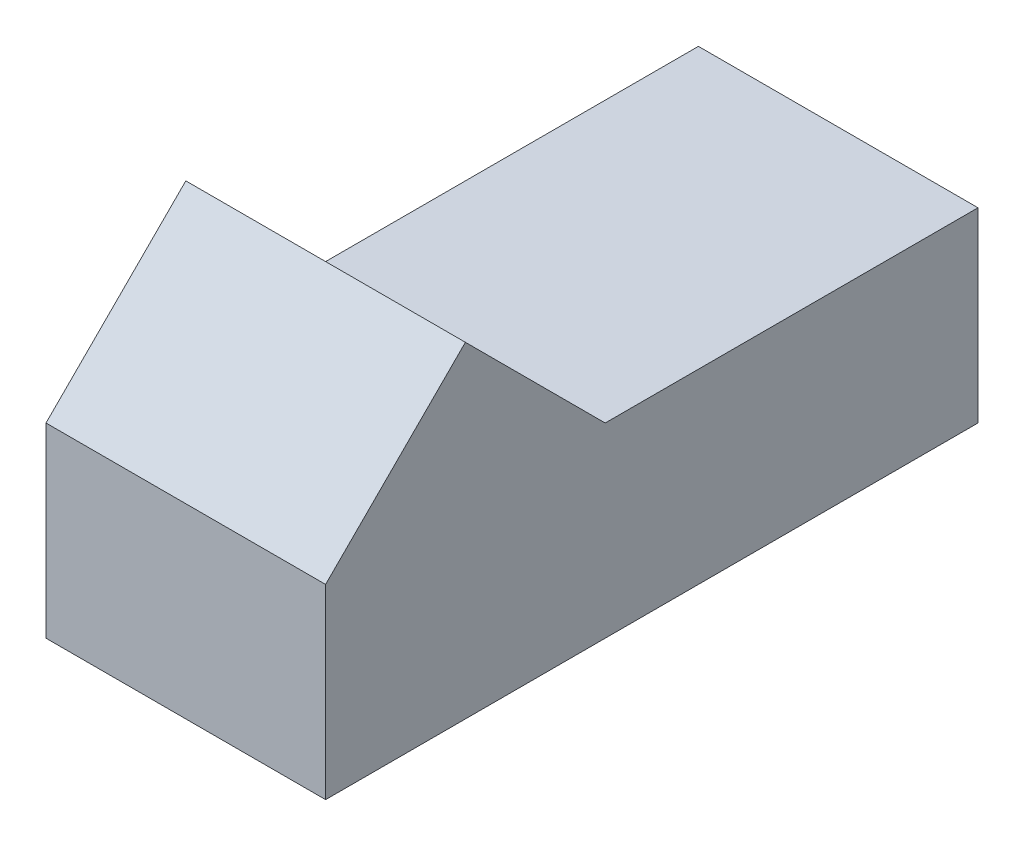
ISO-10303-21;
HEADER;
FILE_DESCRIPTION(('STEP AP214'),'2;1');
FILE_NAME('part.step','',(''),(''),'','','');
FILE_SCHEMA(('AUTOMOTIVE_DESIGN { 1 0 10303 214 1 1 1 1 }'));
ENDSEC;
DATA;
#1=APPLICATION_CONTEXT('core data for automotive mechanical design processes');
#2=APPLICATION_PROTOCOL_DEFINITION('international standard','automotive_design',2000,#1);
#3=PRODUCT_CONTEXT('',#1,'mechanical');
#4=PRODUCT('Part','Part','',(#3));
#5=PRODUCT_RELATED_PRODUCT_CATEGORY('part','',(#4));
#6=PRODUCT_DEFINITION_FORMATION('','',#4);
#7=PRODUCT_DEFINITION_CONTEXT('part definition',#1,'design');
#8=PRODUCT_DEFINITION('design','',#6,#7);
#9=PRODUCT_DEFINITION_SHAPE('','',#8);
#10=(LENGTH_UNIT() NAMED_UNIT(*) SI_UNIT(.MILLI.,.METRE.));
#11=(NAMED_UNIT(*) PLANE_ANGLE_UNIT() SI_UNIT($,.RADIAN.));
#12=(NAMED_UNIT(*) SI_UNIT($,.STERADIAN.) SOLID_ANGLE_UNIT());
#13=UNCERTAINTY_MEASURE_WITH_UNIT(LENGTH_MEASURE(1.E-05),#10,'distance_accuracy_value','');
#14=(GEOMETRIC_REPRESENTATION_CONTEXT(3) GLOBAL_UNCERTAINTY_ASSIGNED_CONTEXT((#13)) GLOBAL_UNIT_ASSIGNED_CONTEXT((#10,
#11,#12)) REPRESENTATION_CONTEXT('',''));
#15=CARTESIAN_POINT('',(0.,0.,0.));
#16=DIRECTION('',(0.,0.,1.));
#17=DIRECTION('',(1.,0.,0.));
#18=AXIS2_PLACEMENT_3D('',#15,#16,#17);
#19=CARTESIAN_POINT('',(3.,29.7963329291001,0.));
#20=DIRECTION('',(0.,-1.,0.));
#21=DIRECTION('',(0.,0.,-1.));
#22=AXIS2_PLACEMENT_3D('',#19,#20,#21);
#23=PLANE('',#22);
#24=DIRECTION('',(0.,0.,1.));
#25=VECTOR('',#24,1.);
#26=CARTESIAN_POINT('',(0.,29.7963329291001,0.));
#27=LINE('',#26,#25);
#28=CARTESIAN_POINT('',(0.,29.7963329291001,-0.000317111119585434));
#29=VERTEX_POINT('',#28);
#30=CARTESIAN_POINT('',(0.,29.7963329291001,3.99968288888042));
#31=VERTEX_POINT('',#30);
#32=EDGE_CURVE('E120',#29,#31,#27,.T.);
#33=ORIENTED_EDGE('',*,*,#32,.T.);
#34=DIRECTION('',(-1.,0.,0.));
#35=VECTOR('',#34,1.);
#36=CARTESIAN_POINT('',(3.,29.7963329291001,3.99968288888042));
#37=LINE('',#36,#35);
#38=CARTESIAN_POINT('',(3.,29.7963329291001,3.99968288888042));
#39=VERTEX_POINT('',#38);
#40=EDGE_CURVE('E11',#39,#31,#37,.T.);
#41=ORIENTED_EDGE('',*,*,#40,.F.);
#42=DIRECTION('',(0.,0.,1.));
#43=VECTOR('',#42,1.);
#44=CARTESIAN_POINT('',(3.,29.7963329291001,0.));
#45=LINE('',#44,#43);
#46=CARTESIAN_POINT('',(3.,29.7963329291001,-0.000317111119585434));
#47=VERTEX_POINT('',#46);
#48=EDGE_CURVE('E132',#47,#39,#45,.T.);
#49=ORIENTED_EDGE('',*,*,#48,.F.);
#50=DIRECTION('',(-1.,0.,0.));
#51=VECTOR('',#50,1.);
#52=CARTESIAN_POINT('',(3.,29.7963329291001,-0.000317111119585434));
#53=LINE('',#52,#51);
#54=EDGE_CURVE('E51',#47,#29,#53,.T.);
#55=ORIENTED_EDGE('',*,*,#54,.T.);
#56=EDGE_LOOP('',(#33,#41,#49,#55));
#57=FACE_BOUND('',#56,.T.);
#58=ADVANCED_FACE('F35',(#57),#23,.F.);
#59=CARTESIAN_POINT('',(3.,12.8983250201098,-12.8983250201098));
#60=DIRECTION('',(0.,-0.707106781186547,0.707106781186548));
#61=DIRECTION('',(0.,-0.707106781186548,-0.707106781186547));
#62=AXIS2_PLACEMENT_3D('',#59,#60,#61);
#63=PLANE('',#62);
#64=DIRECTION('',(0.,0.707106781186548,0.707106781186547));
#65=VECTOR('',#64,1.);
#66=CARTESIAN_POINT('',(0.,12.8983250201098,-12.8983250201098));
#67=LINE('',#66,#65);
#68=CARTESIAN_POINT('',(0.,31.2963329291001,5.49968288888041));
#69=VERTEX_POINT('',#68);
#70=EDGE_CURVE('E122',#31,#69,#67,.T.);
#71=ORIENTED_EDGE('',*,*,#70,.T.);
#72=DIRECTION('',(-1.,0.,0.));
#73=VECTOR('',#72,1.);
#74=CARTESIAN_POINT('',(3.,31.2963329291001,5.49968288888041));
#75=LINE('',#74,#73);
#76=CARTESIAN_POINT('',(3.,31.2963329291001,5.49968288888041));
#77=VERTEX_POINT('',#76);
#78=EDGE_CURVE('E43',#77,#69,#75,.T.);
#79=ORIENTED_EDGE('',*,*,#78,.F.);
#80=DIRECTION('',(0.,0.707106781186548,0.707106781186547));
#81=VECTOR('',#80,1.);
#82=CARTESIAN_POINT('',(3.,12.8983250201098,-12.8983250201098));
#83=LINE('',#82,#81);
#84=EDGE_CURVE('E83',#39,#77,#83,.T.);
#85=ORIENTED_EDGE('',*,*,#84,.F.);
#86=ORIENTED_EDGE('',*,*,#40,.T.);
#87=EDGE_LOOP('',(#71,#79,#85,#86));
#88=FACE_BOUND('',#87,.T.);
#89=ADVANCED_FACE('F152',(#88),#63,.F.);
#90=CARTESIAN_POINT('',(3.,18.3980079089902,18.3980079089902));
#91=DIRECTION('',(0.,-0.707106781186547,-0.707106781186548));
#92=DIRECTION('',(0.,0.707106781186548,-0.707106781186547));
#93=AXIS2_PLACEMENT_3D('',#90,#91,#92);
#94=PLANE('',#93);
#95=DIRECTION('',(0.,-0.707106781186548,0.707106781186547));
#96=VECTOR('',#95,1.);
#97=CARTESIAN_POINT('',(0.,18.3980079089902,18.3980079089902));
#98=LINE('',#97,#96);
#99=CARTESIAN_POINT('',(0.,29.7963329291001,6.9996828888804));
#100=VERTEX_POINT('',#99);
#101=EDGE_CURVE('E124',#69,#100,#98,.T.);
#102=ORIENTED_EDGE('',*,*,#101,.T.);
#103=DIRECTION('',(-1.,0.,0.));
#104=VECTOR('',#103,1.);
#105=CARTESIAN_POINT('',(3.,29.7963329291001,6.9996828888804));
#106=LINE('',#105,#104);
#107=CARTESIAN_POINT('',(3.,29.7963329291001,6.9996828888804));
#108=VERTEX_POINT('',#107);
#109=EDGE_CURVE('E112',#108,#100,#106,.T.);
#110=ORIENTED_EDGE('',*,*,#109,.F.);
#111=DIRECTION('',(0.,-0.707106781186548,0.707106781186547));
#112=VECTOR('',#111,1.);
#113=CARTESIAN_POINT('',(3.,18.3980079089902,18.3980079089902));
#114=LINE('',#113,#112);
#115=EDGE_CURVE('E100',#77,#108,#114,.T.);
#116=ORIENTED_EDGE('',*,*,#115,.F.);
#117=ORIENTED_EDGE('',*,*,#78,.T.);
#118=EDGE_LOOP('',(#102,#110,#116,#117));
#119=FACE_BOUND('',#118,.T.);
#120=ADVANCED_FACE('F138',(#119),#94,.F.);
#121=CARTESIAN_POINT('',(3.,0.,6.9996828888804));
#122=DIRECTION('',(0.,0.,-1.));
#123=DIRECTION('',(-1.,0.,0.));
#124=AXIS2_PLACEMENT_3D('',#121,#122,#123);
#125=PLANE('',#124);
#126=DIRECTION('',(0.,-1.,0.));
#127=VECTOR('',#126,1.);
#128=CARTESIAN_POINT('',(0.,0.,6.9996828888804));
#129=LINE('',#128,#127);
#130=CARTESIAN_POINT('',(0.,27.7963329291001,6.9996828888804));
#131=VERTEX_POINT('',#130);
#132=EDGE_CURVE('E109',#100,#131,#129,.T.);
#133=ORIENTED_EDGE('',*,*,#132,.T.);
#134=DIRECTION('',(-1.,0.,0.));
#135=VECTOR('',#134,1.);
#136=CARTESIAN_POINT('',(3.,27.7963329291001,6.9996828888804));
#137=LINE('',#136,#135);
#138=CARTESIAN_POINT('',(3.,27.7963329291001,6.9996828888804));
#139=VERTEX_POINT('',#138);
#140=EDGE_CURVE('E106',#139,#131,#137,.T.);
#141=ORIENTED_EDGE('',*,*,#140,.F.);
#142=DIRECTION('',(0.,-1.,0.));
#143=VECTOR('',#142,1.);
#144=CARTESIAN_POINT('',(3.,0.,6.9996828888804));
#145=LINE('',#144,#143);
#146=EDGE_CURVE('E93',#108,#139,#145,.T.);
#147=ORIENTED_EDGE('',*,*,#146,.F.);
#148=ORIENTED_EDGE('',*,*,#109,.T.);
#149=EDGE_LOOP('',(#133,#141,#147,#148));
#150=FACE_BOUND('',#149,.T.);
#151=ADVANCED_FACE('F107',(#150),#125,.F.);
#152=CARTESIAN_POINT('',(3.,27.7963329291001,0.));
#153=DIRECTION('',(0.,-1.,0.));
#154=DIRECTION('',(0.,0.,-1.));
#155=AXIS2_PLACEMENT_3D('',#152,#153,#154);
#156=PLANE('',#155);
#157=DIRECTION('',(0.,0.,1.));
#158=VECTOR('',#157,1.);
#159=CARTESIAN_POINT('',(0.,27.7963329291001,0.));
#160=LINE('',#159,#158);
#161=CARTESIAN_POINT('',(0.,27.7963329291001,-0.000317111119585705));
#162=VERTEX_POINT('',#161);
#163=EDGE_CURVE('E127',#162,#131,#160,.T.);
#164=ORIENTED_EDGE('',*,*,#163,.F.);
#165=DIRECTION('',(-1.,0.,0.));
#166=VECTOR('',#165,1.);
#167=CARTESIAN_POINT('',(3.,27.7963329291001,-0.000317111119585705));
#168=LINE('',#167,#166);
#169=CARTESIAN_POINT('',(3.,27.7963329291001,-0.000317111119585705));
#170=VERTEX_POINT('',#169);
#171=EDGE_CURVE('E71',#170,#162,#168,.T.);
#172=ORIENTED_EDGE('',*,*,#171,.F.);
#173=DIRECTION('',(0.,0.,1.));
#174=VECTOR('',#173,1.);
#175=CARTESIAN_POINT('',(3.,27.7963329291001,0.));
#176=LINE('',#175,#174);
#177=EDGE_CURVE('E98',#170,#139,#176,.T.);
#178=ORIENTED_EDGE('',*,*,#177,.T.);
#179=ORIENTED_EDGE('',*,*,#140,.T.);
#180=EDGE_LOOP('',(#164,#172,#178,#179));
#181=FACE_BOUND('',#180,.T.);
#182=ADVANCED_FACE('F114',(#181),#156,.T.);
#183=CARTESIAN_POINT('',(3.,0.,-0.000317111119589472));
#184=DIRECTION('',(0.,0.,-1.));
#185=DIRECTION('',(0.,1.,0.));
#186=AXIS2_PLACEMENT_3D('',#183,#184,#185);
#187=PLANE('',#186);
#188=DIRECTION('',(0.,-1.,0.));
#189=VECTOR('',#188,1.);
#190=CARTESIAN_POINT('',(0.,0.,-0.000317111119589472));
#191=LINE('',#190,#189);
#192=EDGE_CURVE('E129',#29,#162,#191,.T.);
#193=ORIENTED_EDGE('',*,*,#192,.F.);
#194=ORIENTED_EDGE('',*,*,#54,.F.);
#195=DIRECTION('',(0.,-1.,0.));
#196=VECTOR('',#195,1.);
#197=CARTESIAN_POINT('',(3.,0.,-0.000317111119589472));
#198=LINE('',#197,#196);
#199=EDGE_CURVE('E115',#47,#170,#198,.T.);
#200=ORIENTED_EDGE('',*,*,#199,.T.);
#201=ORIENTED_EDGE('',*,*,#171,.T.);
#202=EDGE_LOOP('',(#193,#194,#200,#201));
#203=FACE_BOUND('',#202,.T.);
#204=ADVANCED_FACE('F141',(#203),#187,.T.);
#205=CARTESIAN_POINT('',(3.,0.,0.));
#206=DIRECTION('',(1.,0.,0.));
#207=DIRECTION('',(0.,0.,-1.));
#208=AXIS2_PLACEMENT_3D('',#205,#206,#207);
#209=PLANE('',#208);
#210=ORIENTED_EDGE('',*,*,#48,.T.);
#211=ORIENTED_EDGE('',*,*,#84,.T.);
#212=ORIENTED_EDGE('',*,*,#115,.T.);
#213=ORIENTED_EDGE('',*,*,#146,.T.);
#214=ORIENTED_EDGE('',*,*,#177,.F.);
#215=ORIENTED_EDGE('',*,*,#199,.F.);
#216=EDGE_LOOP('',(#210,#211,#212,#213,#214,#215));
#217=FACE_BOUND('',#216,.T.);
#218=ADVANCED_FACE('F95',(#217),#209,.T.);
#219=CARTESIAN_POINT('',(0.,0.,0.));
#220=DIRECTION('',(1.,0.,0.));
#221=DIRECTION('',(0.,0.,-1.));
#222=AXIS2_PLACEMENT_3D('',#219,#220,#221);
#223=PLANE('',#222);
#224=ORIENTED_EDGE('',*,*,#32,.F.);
#225=ORIENTED_EDGE('',*,*,#192,.T.);
#226=ORIENTED_EDGE('',*,*,#163,.T.);
#227=ORIENTED_EDGE('',*,*,#132,.F.);
#228=ORIENTED_EDGE('',*,*,#101,.F.);
#229=ORIENTED_EDGE('',*,*,#70,.F.);
#230=EDGE_LOOP('',(#224,#225,#226,#227,#228,#229));
#231=FACE_BOUND('',#230,.T.);
#232=ADVANCED_FACE('F140',(#231),#223,.F.);
#233=CLOSED_SHELL('',(#58,#89,#120,#151,#182,#204,#218,#232));
#234=MANIFOLD_SOLID_BREP('B2',#233);
#235=ADVANCED_BREP_SHAPE_REPRESENTATION('',(#18,#234),#14);
#236=SHAPE_DEFINITION_REPRESENTATION(#9,#235);
ENDSEC;
END-ISO-10303-21;
